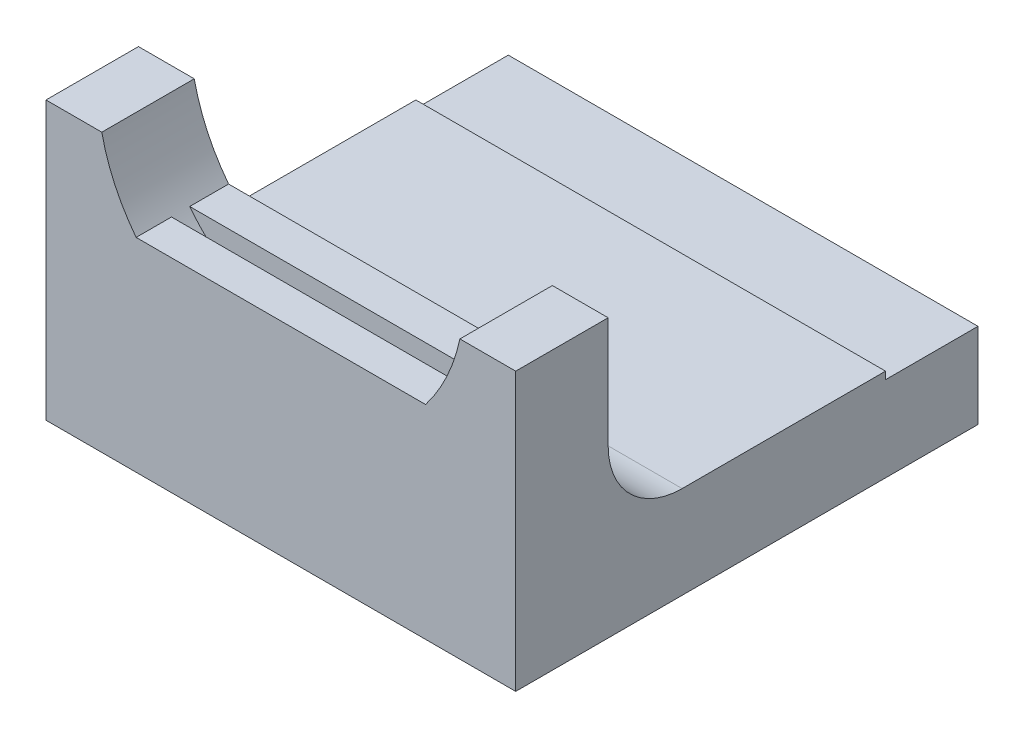
ISO-10303-21;
HEADER;
FILE_DESCRIPTION(('STEP AP214'),'2;1');
FILE_NAME('part.step','',(''),(''),'','','');
FILE_SCHEMA(('AUTOMOTIVE_DESIGN { 1 0 10303 214 1 1 1 1 }'));
ENDSEC;
DATA;
#1=APPLICATION_CONTEXT('core data for automotive mechanical design processes');
#2=APPLICATION_PROTOCOL_DEFINITION('international standard','automotive_design',2000,#1);
#3=PRODUCT_CONTEXT('',#1,'mechanical');
#4=PRODUCT('Part','Part','',(#3));
#5=PRODUCT_RELATED_PRODUCT_CATEGORY('part','',(#4));
#6=PRODUCT_DEFINITION_FORMATION('','',#4);
#7=PRODUCT_DEFINITION_CONTEXT('part definition',#1,'design');
#8=PRODUCT_DEFINITION('design','',#6,#7);
#9=PRODUCT_DEFINITION_SHAPE('','',#8);
#10=(LENGTH_UNIT() NAMED_UNIT(*) SI_UNIT(.MILLI.,.METRE.));
#11=(NAMED_UNIT(*) PLANE_ANGLE_UNIT() SI_UNIT($,.RADIAN.));
#12=(NAMED_UNIT(*) SI_UNIT($,.STERADIAN.) SOLID_ANGLE_UNIT());
#13=UNCERTAINTY_MEASURE_WITH_UNIT(LENGTH_MEASURE(1.E-05),#10,'distance_accuracy_value','');
#14=(GEOMETRIC_REPRESENTATION_CONTEXT(3) GLOBAL_UNCERTAINTY_ASSIGNED_CONTEXT((#13)) GLOBAL_UNIT_ASSIGNED_CONTEXT((#10,
#11,#12)) REPRESENTATION_CONTEXT('',''));
#15=CARTESIAN_POINT('',(0.,0.,0.));
#16=DIRECTION('',(0.,0.,1.));
#17=DIRECTION('',(1.,0.,0.));
#18=AXIS2_PLACEMENT_3D('',#15,#16,#17);
#19=CARTESIAN_POINT('',(0.,75.889063863778,0.));
#20=DIRECTION('',(0.,-1.,0.));
#21=DIRECTION('',(0.,0.,-1.));
#22=AXIS2_PLACEMENT_3D('',#19,#20,#21);
#23=PLANE('',#22);
#24=DIRECTION('',(-1.,0.,0.));
#25=VECTOR('',#24,1.);
#26=CARTESIAN_POINT('',(-33.2204457831326,75.889063863778,25.4));
#27=LINE('',#26,#25);
#28=CARTESIAN_POINT('',(-0.962445783132593,75.889063863778,25.4));
#29=VERTEX_POINT('',#28);
#30=CARTESIAN_POINT('',(-4.7947593866237,75.889063863778,25.4));
#31=VERTEX_POINT('',#30);
#32=EDGE_CURVE('E231',#29,#31,#27,.T.);
#33=ORIENTED_EDGE('',*,*,#32,.T.);
#34=DIRECTION('',(0.,0.,1.));
#35=VECTOR('',#34,1.);
#36=CARTESIAN_POINT('',(-4.7947593866237,75.889063863778,-0.001000000000001));
#37=LINE('',#36,#35);
#38=CARTESIAN_POINT('',(-4.7947593866237,75.889063863778,31.75));
#39=VERTEX_POINT('',#38);
#40=EDGE_CURVE('E205',#39,#31,#37,.F.);
#41=ORIENTED_EDGE('',*,*,#40,.F.);
#42=DIRECTION('',(1.,0.,0.));
#43=VECTOR('',#42,1.);
#44=CARTESIAN_POINT('',(-33.2204457831326,75.889063863778,31.75));
#45=LINE('',#44,#43);
#46=CARTESIAN_POINT('',(-0.962445783132593,75.889063863778,31.75));
#47=VERTEX_POINT('',#46);
#48=EDGE_CURVE('E222',#39,#47,#45,.T.);
#49=ORIENTED_EDGE('',*,*,#48,.T.);
#50=DIRECTION('',(0.,0.,-1.));
#51=VECTOR('',#50,1.);
#52=CARTESIAN_POINT('',(-0.962445783132593,75.889063863778,31.75));
#53=LINE('',#52,#51);
#54=EDGE_CURVE('E227',#47,#29,#53,.T.);
#55=ORIENTED_EDGE('',*,*,#54,.T.);
#56=EDGE_LOOP('',(#33,#41,#49,#55));
#57=FACE_BOUND('',#56,.T.);
#58=ADVANCED_FACE('F41',(#57),#23,.F.);
#59=CARTESIAN_POINT('',(-33.2204457831326,63.189063863778,31.75));
#60=DIRECTION('',(0.,-1.,0.));
#61=DIRECTION('',(0.,0.,-1.));
#62=AXIS2_PLACEMENT_3D('',#59,#60,#61);
#63=PLANE('',#62);
#64=DIRECTION('',(0.,0.,-1.));
#65=VECTOR('',#64,1.);
#66=CARTESIAN_POINT('',(-33.2204457831326,63.189063863778,31.75));
#67=LINE('',#66,#65);
#68=CARTESIAN_POINT('',(-33.2204457831326,63.189063863778,20.32));
#69=VERTEX_POINT('',#68);
#70=CARTESIAN_POINT('',(-33.2204457831326,63.189063863778,6.35));
#71=VERTEX_POINT('',#70);
#72=EDGE_CURVE('E250',#69,#71,#67,.T.);
#73=ORIENTED_EDGE('',*,*,#72,.F.);
#74=DIRECTION('',(-1.,0.,0.));
#75=VECTOR('',#74,1.);
#76=CARTESIAN_POINT('',(-0.962445783132593,63.189063863778,20.32));
#77=LINE('',#76,#75);
#78=CARTESIAN_POINT('',(-0.962445783132593,63.189063863778,20.32));
#79=VERTEX_POINT('',#78);
#80=EDGE_CURVE('E295',#69,#79,#77,.F.);
#81=ORIENTED_EDGE('',*,*,#80,.T.);
#82=DIRECTION('',(0.,0.,-1.));
#83=VECTOR('',#82,1.);
#84=CARTESIAN_POINT('',(-0.962445783132593,63.189063863778,31.75));
#85=LINE('',#84,#83);
#86=CARTESIAN_POINT('',(-0.962445783132593,63.189063863778,6.35));
#87=VERTEX_POINT('',#86);
#88=EDGE_CURVE('E253',#79,#87,#85,.T.);
#89=ORIENTED_EDGE('',*,*,#88,.T.);
#90=DIRECTION('',(1.,0.,0.));
#91=VECTOR('',#90,1.);
#92=CARTESIAN_POINT('',(0.,63.189063863778,6.35));
#93=LINE('',#92,#91);
#94=EDGE_CURVE('E158',#71,#87,#93,.T.);
#95=ORIENTED_EDGE('',*,*,#94,.F.);
#96=EDGE_LOOP('',(#73,#81,#89,#95));
#97=FACE_BOUND('',#96,.T.);
#98=ADVANCED_FACE('F344',(#97),#63,.F.);
#99=CARTESIAN_POINT('',(-33.2204457831326,63.189063863778,31.75));
#100=DIRECTION('',(1.,0.,0.));
#101=DIRECTION('',(0.,0.,-1.));
#102=AXIS2_PLACEMENT_3D('',#99,#100,#101);
#103=PLANE('',#102);
#104=DIRECTION('',(0.,0.,-1.));
#105=VECTOR('',#104,1.);
#106=CARTESIAN_POINT('',(-33.2204457831326,56.839063863778,31.75));
#107=LINE('',#106,#105);
#108=CARTESIAN_POINT('',(-33.2204457831326,56.839063863778,31.75));
#109=VERTEX_POINT('',#108);
#110=CARTESIAN_POINT('',(-33.2204457831326,56.839063863778,0.));
#111=VERTEX_POINT('',#110);
#112=EDGE_CURVE('E150',#109,#111,#107,.T.);
#113=ORIENTED_EDGE('',*,*,#112,.F.);
#114=DIRECTION('',(0.,-1.,0.));
#115=VECTOR('',#114,1.);
#116=CARTESIAN_POINT('',(-33.2204457831326,63.189063863778,31.75));
#117=LINE('',#116,#115);
#118=CARTESIAN_POINT('',(-33.2204457831326,75.889063863778,31.75));
#119=VERTEX_POINT('',#118);
#120=EDGE_CURVE('E242',#119,#109,#117,.T.);
#121=ORIENTED_EDGE('',*,*,#120,.F.);
#122=DIRECTION('',(0.,0.,1.));
#123=VECTOR('',#122,1.);
#124=CARTESIAN_POINT('',(-33.2204457831326,75.889063863778,31.75));
#125=LINE('',#124,#123);
#126=CARTESIAN_POINT('',(-33.2204457831326,75.889063863778,25.4));
#127=VERTEX_POINT('',#126);
#128=EDGE_CURVE('E218',#127,#119,#125,.T.);
#129=ORIENTED_EDGE('',*,*,#128,.F.);
#130=DIRECTION('',(0.,-1.,0.));
#131=VECTOR('',#130,1.);
#132=CARTESIAN_POINT('',(-33.2204457831326,75.889063863778,25.4));
#133=LINE('',#132,#131);
#134=CARTESIAN_POINT('',(-33.2204457831326,68.269063863778,25.4));
#135=VERTEX_POINT('',#134);
#136=EDGE_CURVE('E235',#127,#135,#133,.T.);
#137=ORIENTED_EDGE('',*,*,#136,.T.);
#138=CARTESIAN_POINT('',(-33.2204457831326,68.269063863778,20.32));
#139=DIRECTION('',(1.,0.,0.));
#140=DIRECTION('',(0.,0.,-1.));
#141=AXIS2_PLACEMENT_3D('',#138,#139,#140);
#142=CIRCLE('',#141,5.08);
#143=EDGE_CURVE('E50',#135,#69,#142,.T.);
#144=ORIENTED_EDGE('',*,*,#143,.T.);
#145=ORIENTED_EDGE('',*,*,#72,.T.);
#146=DIRECTION('',(0.,1.,0.));
#147=VECTOR('',#146,1.);
#148=CARTESIAN_POINT('',(-33.2204457831326,0.,6.35));
#149=LINE('',#148,#147);
#150=CARTESIAN_POINT('',(-33.2204457831326,62.681063863778,6.35));
#151=VERTEX_POINT('',#150);
#152=EDGE_CURVE('E265',#151,#71,#149,.T.);
#153=ORIENTED_EDGE('',*,*,#152,.F.);
#154=DIRECTION('',(0.,0.,1.));
#155=VECTOR('',#154,1.);
#156=CARTESIAN_POINT('',(-33.2204457831326,62.681063863778,0.));
#157=LINE('',#156,#155);
#158=CARTESIAN_POINT('',(-33.2204457831326,62.681063863778,0.));
#159=VERTEX_POINT('',#158);
#160=EDGE_CURVE('E57',#159,#151,#157,.T.);
#161=ORIENTED_EDGE('',*,*,#160,.F.);
#162=DIRECTION('',(0.,-1.,0.));
#163=VECTOR('',#162,1.);
#164=CARTESIAN_POINT('',(-33.2204457831326,62.681063863778,0.));
#165=LINE('',#164,#163);
#166=EDGE_CURVE('E166',#159,#111,#165,.T.);
#167=ORIENTED_EDGE('',*,*,#166,.T.);
#168=EDGE_LOOP('',(#113,#121,#129,#137,#144,#145,#153,#161,#167));
#169=FACE_BOUND('',#168,.T.);
#170=ADVANCED_FACE('F172',(#169),#103,.F.);
#171=CARTESIAN_POINT('',(-33.2204457831326,56.839063863778,31.75));
#172=DIRECTION('',(0.,1.,0.));
#173=DIRECTION('',(-1.,0.,0.));
#174=AXIS2_PLACEMENT_3D('',#171,#172,#173);
#175=PLANE('',#174);
#176=ORIENTED_EDGE('',*,*,#112,.T.);
#177=DIRECTION('',(-1.,0.,0.));
#178=VECTOR('',#177,1.);
#179=CARTESIAN_POINT('',(-0.962445783132594,56.839063863778,0.));
#180=LINE('',#179,#178);
#181=CARTESIAN_POINT('',(-0.962445783132594,56.839063863778,0.));
#182=VERTEX_POINT('',#181);
#183=EDGE_CURVE('E154',#182,#111,#180,.T.);
#184=ORIENTED_EDGE('',*,*,#183,.F.);
#185=DIRECTION('',(0.,0.,-1.));
#186=VECTOR('',#185,1.);
#187=CARTESIAN_POINT('',(-0.962445783132593,56.839063863778,31.75));
#188=LINE('',#187,#186);
#189=CARTESIAN_POINT('',(-0.962445783132593,56.839063863778,31.75));
#190=VERTEX_POINT('',#189);
#191=EDGE_CURVE('E159',#190,#182,#188,.T.);
#192=ORIENTED_EDGE('',*,*,#191,.F.);
#193=DIRECTION('',(1.,0.,0.));
#194=VECTOR('',#193,1.);
#195=CARTESIAN_POINT('',(-33.2204457831326,56.839063863778,31.75));
#196=LINE('',#195,#194);
#197=EDGE_CURVE('E155',#109,#190,#196,.T.);
#198=ORIENTED_EDGE('',*,*,#197,.F.);
#199=EDGE_LOOP('',(#176,#184,#192,#198));
#200=FACE_BOUND('',#199,.T.);
#201=ADVANCED_FACE('F152',(#200),#175,.F.);
#202=CARTESIAN_POINT('',(-0.962445783132593,63.189063863778,31.75));
#203=DIRECTION('',(-1.,0.,0.));
#204=DIRECTION('',(0.,0.,1.));
#205=AXIS2_PLACEMENT_3D('',#202,#203,#204);
#206=PLANE('',#205);
#207=ORIENTED_EDGE('',*,*,#54,.F.);
#208=DIRECTION('',(0.,1.,0.));
#209=VECTOR('',#208,1.);
#210=CARTESIAN_POINT('',(-0.962445783132593,63.189063863778,31.75));
#211=LINE('',#210,#209);
#212=EDGE_CURVE('E247',#190,#47,#211,.T.);
#213=ORIENTED_EDGE('',*,*,#212,.F.);
#214=ORIENTED_EDGE('',*,*,#191,.T.);
#215=DIRECTION('',(0.,-1.,0.));
#216=VECTOR('',#215,1.);
#217=CARTESIAN_POINT('',(-0.962445783132593,62.681063863778,0.));
#218=LINE('',#217,#216);
#219=CARTESIAN_POINT('',(-0.962445783132593,62.681063863778,0.));
#220=VERTEX_POINT('',#219);
#221=EDGE_CURVE('E168',#220,#182,#218,.T.);
#222=ORIENTED_EDGE('',*,*,#221,.F.);
#223=DIRECTION('',(0.,0.,1.));
#224=VECTOR('',#223,1.);
#225=CARTESIAN_POINT('',(-0.962445783132593,62.681063863778,0.));
#226=LINE('',#225,#224);
#227=CARTESIAN_POINT('',(-0.962445783132593,62.681063863778,6.35));
#228=VERTEX_POINT('',#227);
#229=EDGE_CURVE('E182',#220,#228,#226,.T.);
#230=ORIENTED_EDGE('',*,*,#229,.T.);
#231=DIRECTION('',(0.,-1.,0.));
#232=VECTOR('',#231,1.);
#233=CARTESIAN_POINT('',(-0.962445783132593,0.,6.35));
#234=LINE('',#233,#232);
#235=EDGE_CURVE('E261',#87,#228,#234,.T.);
#236=ORIENTED_EDGE('',*,*,#235,.F.);
#237=ORIENTED_EDGE('',*,*,#88,.F.);
#238=CARTESIAN_POINT('',(-0.962445783132593,68.269063863778,20.32));
#239=DIRECTION('',(-1.,0.,0.));
#240=DIRECTION('',(0.,0.,1.));
#241=AXIS2_PLACEMENT_3D('',#238,#239,#240);
#242=CIRCLE('',#241,5.08);
#243=CARTESIAN_POINT('',(-0.962445783132593,68.269063863778,25.4));
#244=VERTEX_POINT('',#243);
#245=EDGE_CURVE('E11',#79,#244,#242,.T.);
#246=ORIENTED_EDGE('',*,*,#245,.T.);
#247=DIRECTION('',(0.,-1.,0.));
#248=VECTOR('',#247,1.);
#249=CARTESIAN_POINT('',(-0.962445783132593,75.889063863778,25.4));
#250=LINE('',#249,#248);
#251=EDGE_CURVE('E238',#29,#244,#250,.T.);
#252=ORIENTED_EDGE('',*,*,#251,.F.);
#253=EDGE_LOOP('',(#207,#213,#214,#222,#230,#236,#237,#246,#252));
#254=FACE_BOUND('',#253,.T.);
#255=ADVANCED_FACE('F318',(#254),#206,.F.);
#256=CARTESIAN_POINT('',(0.,0.,31.75));
#257=DIRECTION('',(0.,0.,1.));
#258=DIRECTION('',(1.,0.,0.));
#259=AXIS2_PLACEMENT_3D('',#256,#257,#258);
#260=PLANE('',#259);
#261=ORIENTED_EDGE('',*,*,#120,.T.);
#262=ORIENTED_EDGE('',*,*,#197,.T.);
#263=ORIENTED_EDGE('',*,*,#212,.T.);
#264=ORIENTED_EDGE('',*,*,#48,.F.);
#265=CARTESIAN_POINT('',(-17.0914457831326,78.5104819277108,31.75));
#266=DIRECTION('',(0.,0.,1.));
#267=DIRECTION('',(1.,0.,0.));
#268=AXIS2_PLACEMENT_3D('',#265,#266,#267);
#269=CIRCLE('',#268,12.573);
#270=CARTESIAN_POINT('',(-7.15321209678122,70.809063863778,31.75));
#271=VERTEX_POINT('',#270);
#272=EDGE_CURVE('E208',#271,#39,#269,.T.);
#273=ORIENTED_EDGE('',*,*,#272,.F.);
#274=DIRECTION('',(1.,0.,0.));
#275=VECTOR('',#274,1.);
#276=CARTESIAN_POINT('',(-0.962445783132593,70.809063863778,31.75));
#277=LINE('',#276,#275);
#278=CARTESIAN_POINT('',(-27.0296794694839,70.809063863778,31.75));
#279=VERTEX_POINT('',#278);
#280=EDGE_CURVE('E193',#279,#271,#277,.T.);
#281=ORIENTED_EDGE('',*,*,#280,.F.);
#282=CARTESIAN_POINT('',(-29.3881321796415,75.889063863778,31.75));
#283=VERTEX_POINT('',#282);
#284=EDGE_CURVE('E209',#283,#279,#269,.T.);
#285=ORIENTED_EDGE('',*,*,#284,.F.);
#286=EDGE_CURVE('E223',#119,#283,#45,.T.);
#287=ORIENTED_EDGE('',*,*,#286,.F.);
#288=EDGE_LOOP('',(#261,#262,#263,#264,#273,#281,#285,#287));
#289=FACE_BOUND('',#288,.T.);
#290=ADVANCED_FACE('F315',(#289),#260,.T.);
#291=CARTESIAN_POINT('',(-33.2204457831326,75.889063863778,25.4));
#292=DIRECTION('',(0.,0.,1.));
#293=DIRECTION('',(1.,0.,0.));
#294=AXIS2_PLACEMENT_3D('',#291,#292,#293);
#295=PLANE('',#294);
#296=ORIENTED_EDGE('',*,*,#251,.T.);
#297=DIRECTION('',(-1.,0.,0.));
#298=VECTOR('',#297,1.);
#299=CARTESIAN_POINT('',(-33.2204457831326,68.269063863778,25.4));
#300=LINE('',#299,#298);
#301=EDGE_CURVE('E291',#244,#135,#300,.T.);
#302=ORIENTED_EDGE('',*,*,#301,.T.);
#303=ORIENTED_EDGE('',*,*,#136,.F.);
#304=CARTESIAN_POINT('',(-29.3881321796415,75.889063863778,25.4));
#305=VERTEX_POINT('',#304);
#306=EDGE_CURVE('E230',#305,#127,#27,.T.);
#307=ORIENTED_EDGE('',*,*,#306,.F.);
#308=CARTESIAN_POINT('',(-17.0914457831326,78.5104819277108,25.4));
#309=DIRECTION('',(0.,0.,1.));
#310=DIRECTION('',(1.,0.,0.));
#311=AXIS2_PLACEMENT_3D('',#308,#309,#310);
#312=CIRCLE('',#311,12.573);
#313=CARTESIAN_POINT('',(-27.0296794694839,70.809063863778,25.4));
#314=VERTEX_POINT('',#313);
#315=EDGE_CURVE('E213',#314,#305,#312,.F.);
#316=ORIENTED_EDGE('',*,*,#315,.F.);
#317=DIRECTION('',(-1.,0.,0.));
#318=VECTOR('',#317,1.);
#319=CARTESIAN_POINT('',(-33.2204457831326,70.809063863778,25.4));
#320=LINE('',#319,#318);
#321=CARTESIAN_POINT('',(-7.15321209678122,70.809063863778,25.4));
#322=VERTEX_POINT('',#321);
#323=EDGE_CURVE('E199',#322,#314,#320,.T.);
#324=ORIENTED_EDGE('',*,*,#323,.F.);
#325=EDGE_CURVE('E214',#31,#322,#312,.F.);
#326=ORIENTED_EDGE('',*,*,#325,.F.);
#327=ORIENTED_EDGE('',*,*,#32,.F.);
#328=EDGE_LOOP('',(#296,#302,#303,#307,#316,#324,#326,#327));
#329=FACE_BOUND('',#328,.T.);
#330=ADVANCED_FACE('F324',(#329),#295,.F.);
#331=ORIENTED_EDGE('',*,*,#286,.T.);
#332=DIRECTION('',(0.,0.,1.));
#333=VECTOR('',#332,1.);
#334=CARTESIAN_POINT('',(-29.3881321796415,75.889063863778,-0.001000000000001));
#335=LINE('',#334,#333);
#336=EDGE_CURVE('E202',#305,#283,#335,.T.);
#337=ORIENTED_EDGE('',*,*,#336,.F.);
#338=ORIENTED_EDGE('',*,*,#306,.T.);
#339=ORIENTED_EDGE('',*,*,#128,.T.);
#340=EDGE_LOOP('',(#331,#337,#338,#339));
#341=FACE_BOUND('',#340,.T.);
#342=ADVANCED_FACE('F341',(#341),#23,.F.);
#343=CARTESIAN_POINT('',(-17.0914457831326,78.5104819277108,-0.001000000000001));
#344=DIRECTION('',(0.,0.,1.));
#345=DIRECTION('',(1.,0.,0.));
#346=AXIS2_PLACEMENT_3D('',#343,#344,#345);
#347=CYLINDRICAL_SURFACE('',#346,12.573);
#348=ORIENTED_EDGE('',*,*,#284,.T.);
#349=DIRECTION('',(0.,0.,1.));
#350=VECTOR('',#349,1.);
#351=CARTESIAN_POINT('',(-27.0296794694839,70.809063863778,-0.001000000000001));
#352=LINE('',#351,#350);
#353=CARTESIAN_POINT('',(-27.0296794694839,70.809063863778,29.3212390471059));
#354=VERTEX_POINT('',#353);
#355=EDGE_CURVE('E287',#279,#354,#352,.F.);
#356=ORIENTED_EDGE('',*,*,#355,.T.);
#357=CARTESIAN_POINT('',(-17.0914457831326,78.5104819277108,29.3212390471059));
#358=DIRECTION('',(0.,0.,1.));
#359=DIRECTION('',(1.,0.,0.));
#360=AXIS2_PLACEMENT_3D('',#357,#358,#359);
#361=CIRCLE('',#360,12.573);
#362=CARTESIAN_POINT('',(-7.15321209678122,70.809063863778,29.3212390471059));
#363=VERTEX_POINT('',#362);
#364=EDGE_CURVE('E284',#363,#354,#361,.F.);
#365=ORIENTED_EDGE('',*,*,#364,.F.);
#366=DIRECTION('',(0.,0.,1.));
#367=VECTOR('',#366,1.);
#368=CARTESIAN_POINT('',(-7.15321209678122,70.809063863778,-0.001000000000001));
#369=LINE('',#368,#367);
#370=EDGE_CURVE('E280',#363,#271,#369,.T.);
#371=ORIENTED_EDGE('',*,*,#370,.T.);
#372=ORIENTED_EDGE('',*,*,#272,.T.);
#373=ORIENTED_EDGE('',*,*,#40,.T.);
#374=ORIENTED_EDGE('',*,*,#325,.T.);
#375=DIRECTION('',(0.,0.,1.));
#376=VECTOR('',#375,1.);
#377=CARTESIAN_POINT('',(-7.15321209678122,70.809063863778,-0.001000000000001));
#378=LINE('',#377,#376);
#379=CARTESIAN_POINT('',(-7.15321209678122,70.809063863778,28.0712390471059));
#380=VERTEX_POINT('',#379);
#381=EDGE_CURVE('E268',#322,#380,#378,.T.);
#382=ORIENTED_EDGE('',*,*,#381,.T.);
#383=CARTESIAN_POINT('',(-17.0914457831326,78.5104819277108,28.0712390471059));
#384=DIRECTION('',(0.,0.,-1.));
#385=DIRECTION('',(-1.,0.,0.));
#386=AXIS2_PLACEMENT_3D('',#383,#384,#385);
#387=CIRCLE('',#386,12.573);
#388=CARTESIAN_POINT('',(-27.0296794694839,70.809063863778,28.0712390471059));
#389=VERTEX_POINT('',#388);
#390=EDGE_CURVE('E272',#389,#380,#387,.F.);
#391=ORIENTED_EDGE('',*,*,#390,.F.);
#392=DIRECTION('',(0.,0.,1.));
#393=VECTOR('',#392,1.);
#394=CARTESIAN_POINT('',(-27.0296794694839,70.809063863778,-0.001000000000001));
#395=LINE('',#394,#393);
#396=EDGE_CURVE('E276',#389,#314,#395,.F.);
#397=ORIENTED_EDGE('',*,*,#396,.T.);
#398=ORIENTED_EDGE('',*,*,#315,.T.);
#399=ORIENTED_EDGE('',*,*,#336,.T.);
#400=EDGE_LOOP('',(#348,#356,#365,#371,#372,#373,#374,#382,#391,#397,#398,#399));
#401=FACE_BOUND('',#400,.T.);
#402=ADVANCED_FACE('F306',(#401),#347,.F.);
#403=CARTESIAN_POINT('',(-33.2204457831326,70.809063863778,28.0712390471059));
#404=DIRECTION('',(0.,0.,-1.));
#405=DIRECTION('',(-1.,0.,0.));
#406=AXIS2_PLACEMENT_3D('',#403,#404,#405);
#407=PLANE('',#406);
#408=DIRECTION('',(1.,0.,0.));
#409=VECTOR('',#408,1.);
#410=CARTESIAN_POINT('',(-33.2204457831326,70.809063863778,28.0712390471059));
#411=LINE('',#410,#409);
#412=EDGE_CURVE('E196',#389,#380,#411,.T.);
#413=ORIENTED_EDGE('',*,*,#412,.F.);
#414=ORIENTED_EDGE('',*,*,#390,.T.);
#415=EDGE_LOOP('',(#413,#414));
#416=FACE_BOUND('',#415,.T.);
#417=ADVANCED_FACE('F332',(#416),#407,.F.);
#418=CARTESIAN_POINT('',(0.,70.809063863778,0.));
#419=DIRECTION('',(0.,1.,0.));
#420=DIRECTION('',(0.,0.,1.));
#421=AXIS2_PLACEMENT_3D('',#418,#419,#420);
#422=PLANE('',#421);
#423=ORIENTED_EDGE('',*,*,#396,.F.);
#424=ORIENTED_EDGE('',*,*,#412,.T.);
#425=ORIENTED_EDGE('',*,*,#381,.F.);
#426=ORIENTED_EDGE('',*,*,#323,.T.);
#427=EDGE_LOOP('',(#423,#424,#425,#426));
#428=FACE_BOUND('',#427,.T.);
#429=ADVANCED_FACE('F329',(#428),#422,.T.);
#430=CARTESIAN_POINT('',(-0.962445783132593,70.809063863778,29.3212390471059));
#431=DIRECTION('',(0.,0.,1.));
#432=DIRECTION('',(1.,0.,0.));
#433=AXIS2_PLACEMENT_3D('',#430,#431,#432);
#434=PLANE('',#433);
#435=DIRECTION('',(-1.,0.,0.));
#436=VECTOR('',#435,1.);
#437=CARTESIAN_POINT('',(-0.962445783132593,70.809063863778,29.3212390471059));
#438=LINE('',#437,#436);
#439=EDGE_CURVE('E189',#363,#354,#438,.T.);
#440=ORIENTED_EDGE('',*,*,#439,.F.);
#441=ORIENTED_EDGE('',*,*,#364,.T.);
#442=EDGE_LOOP('',(#440,#441));
#443=FACE_BOUND('',#442,.T.);
#444=ADVANCED_FACE('F339',(#443),#434,.F.);
#445=CARTESIAN_POINT('',(0.,70.809063863778,0.));
#446=DIRECTION('',(0.,1.,0.));
#447=DIRECTION('',(0.,0.,1.));
#448=AXIS2_PLACEMENT_3D('',#445,#446,#447);
#449=PLANE('',#448);
#450=ORIENTED_EDGE('',*,*,#355,.F.);
#451=ORIENTED_EDGE('',*,*,#280,.T.);
#452=ORIENTED_EDGE('',*,*,#370,.F.);
#453=ORIENTED_EDGE('',*,*,#439,.T.);
#454=EDGE_LOOP('',(#450,#451,#452,#453));
#455=FACE_BOUND('',#454,.T.);
#456=ADVANCED_FACE('F379',(#455),#449,.T.);
#457=CARTESIAN_POINT('',(-33.2204457831326,68.269063863778,20.32));
#458=DIRECTION('',(1.,0.,0.));
#459=DIRECTION('',(0.,0.,-1.));
#460=AXIS2_PLACEMENT_3D('',#457,#458,#459);
#461=CYLINDRICAL_SURFACE('',#460,5.08);
#462=ORIENTED_EDGE('',*,*,#245,.F.);
#463=ORIENTED_EDGE('',*,*,#80,.F.);
#464=ORIENTED_EDGE('',*,*,#143,.F.);
#465=ORIENTED_EDGE('',*,*,#301,.F.);
#466=EDGE_LOOP('',(#462,#463,#464,#465));
#467=FACE_BOUND('',#466,.T.);
#468=ADVANCED_FACE('F43',(#467),#461,.F.);
#469=CARTESIAN_POINT('',(0.,0.,6.35));
#470=DIRECTION('',(0.,0.,1.));
#471=DIRECTION('',(1.,0.,0.));
#472=AXIS2_PLACEMENT_3D('',#469,#470,#471);
#473=PLANE('',#472);
#474=ORIENTED_EDGE('',*,*,#235,.T.);
#475=DIRECTION('',(-1.,0.,0.));
#476=VECTOR('',#475,1.);
#477=CARTESIAN_POINT('',(-0.962445783132593,62.681063863778,6.35));
#478=LINE('',#477,#476);
#479=EDGE_CURVE('E170',#228,#151,#478,.T.);
#480=ORIENTED_EDGE('',*,*,#479,.T.);
#481=ORIENTED_EDGE('',*,*,#152,.T.);
#482=ORIENTED_EDGE('',*,*,#94,.T.);
#483=EDGE_LOOP('',(#474,#480,#481,#482));
#484=FACE_BOUND('',#483,.T.);
#485=ADVANCED_FACE('F368',(#484),#473,.F.);
#486=CARTESIAN_POINT('',(-0.962445783132593,62.681063863778,0.));
#487=DIRECTION('',(0.,1.,0.));
#488=DIRECTION('',(0.,0.,1.));
#489=AXIS2_PLACEMENT_3D('',#486,#487,#488);
#490=PLANE('',#489);
#491=ORIENTED_EDGE('',*,*,#479,.F.);
#492=ORIENTED_EDGE('',*,*,#229,.F.);
#493=DIRECTION('',(-1.,0.,0.));
#494=VECTOR('',#493,1.);
#495=CARTESIAN_POINT('',(-0.962445783132593,62.681063863778,0.));
#496=LINE('',#495,#494);
#497=EDGE_CURVE('E175',#220,#159,#496,.T.);
#498=ORIENTED_EDGE('',*,*,#497,.T.);
#499=ORIENTED_EDGE('',*,*,#160,.T.);
#500=EDGE_LOOP('',(#491,#492,#498,#499));
#501=FACE_BOUND('',#500,.T.);
#502=ADVANCED_FACE('F369',(#501),#490,.T.);
#503=CARTESIAN_POINT('',(0.,0.,0.));
#504=DIRECTION('',(0.,0.,1.));
#505=DIRECTION('',(1.,0.,0.));
#506=AXIS2_PLACEMENT_3D('',#503,#504,#505);
#507=PLANE('',#506);
#508=ORIENTED_EDGE('',*,*,#183,.T.);
#509=ORIENTED_EDGE('',*,*,#166,.F.);
#510=ORIENTED_EDGE('',*,*,#497,.F.);
#511=ORIENTED_EDGE('',*,*,#221,.T.);
#512=EDGE_LOOP('',(#508,#509,#510,#511));
#513=FACE_BOUND('',#512,.T.);
#514=ADVANCED_FACE('F164',(#513),#507,.F.);
#515=CLOSED_SHELL('',(#58,#98,#170,#201,#255,#290,#330,#342,#402,#417,#429,#444,#456,#468,#485,
#502,#514));
#516=MANIFOLD_SOLID_BREP('B2',#515);
#517=ADVANCED_BREP_SHAPE_REPRESENTATION('',(#18,#516),#14);
#518=SHAPE_DEFINITION_REPRESENTATION(#9,#517);
ENDSEC;
END-ISO-10303-21;
